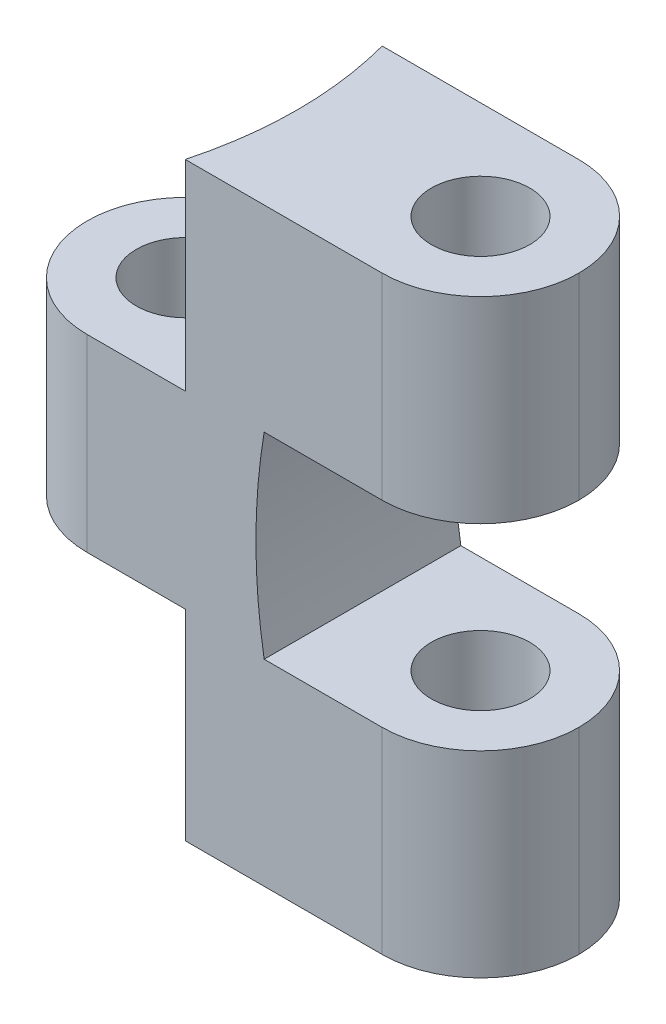
ISO-10303-21;
HEADER;
FILE_DESCRIPTION(('STEP AP214'),'2;1');
FILE_NAME('part.step','',(''),(''),'','','');
FILE_SCHEMA(('AUTOMOTIVE_DESIGN { 1 0 10303 214 1 1 1 1 }'));
ENDSEC;
DATA;
#1=APPLICATION_CONTEXT('core data for automotive mechanical design processes');
#2=APPLICATION_PROTOCOL_DEFINITION('international standard','automotive_design',2000,#1);
#3=PRODUCT_CONTEXT('',#1,'mechanical');
#4=PRODUCT('Part','Part','',(#3));
#5=PRODUCT_RELATED_PRODUCT_CATEGORY('part','',(#4));
#6=PRODUCT_DEFINITION_FORMATION('','',#4);
#7=PRODUCT_DEFINITION_CONTEXT('part definition',#1,'design');
#8=PRODUCT_DEFINITION('design','',#6,#7);
#9=PRODUCT_DEFINITION_SHAPE('','',#8);
#10=(LENGTH_UNIT() NAMED_UNIT(*) SI_UNIT(.MILLI.,.METRE.));
#11=(NAMED_UNIT(*) PLANE_ANGLE_UNIT() SI_UNIT($,.RADIAN.));
#12=(NAMED_UNIT(*) SI_UNIT($,.STERADIAN.) SOLID_ANGLE_UNIT());
#13=UNCERTAINTY_MEASURE_WITH_UNIT(LENGTH_MEASURE(1.E-05),#10,'distance_accuracy_value','');
#14=(GEOMETRIC_REPRESENTATION_CONTEXT(3) GLOBAL_UNCERTAINTY_ASSIGNED_CONTEXT((#13)) GLOBAL_UNIT_ASSIGNED_CONTEXT((#10,
#11,#12)) REPRESENTATION_CONTEXT('',''));
#15=CARTESIAN_POINT('',(0.,0.,0.));
#16=DIRECTION('',(0.,0.,1.));
#17=DIRECTION('',(1.,0.,0.));
#18=AXIS2_PLACEMENT_3D('',#15,#16,#17);
#19=CARTESIAN_POINT('',(-9.99999999999999,-39.0322943214974,10.));
#20=DIRECTION('',(1.,0.,0.));
#21=DIRECTION('',(0.,1.,0.));
#22=AXIS2_PLACEMENT_3D('',#19,#20,#21);
#23=PLANE('',#22);
#24=DIRECTION('',(0.,-1.,0.));
#25=VECTOR('',#24,1.);
#26=CARTESIAN_POINT('',(-9.99999999999999,-39.0322943214974,0.));
#27=LINE('',#26,#25);
#28=CARTESIAN_POINT('',(-10.,-4.8,0.));
#29=VERTEX_POINT('',#28);
#30=CARTESIAN_POINT('',(-10.,-5.,0.));
#31=VERTEX_POINT('',#30);
#32=EDGE_CURVE('E214',#29,#31,#27,.T.);
#33=ORIENTED_EDGE('',*,*,#32,.T.);
#34=DIRECTION('',(0.,0.,-1.));
#35=VECTOR('',#34,1.);
#36=CARTESIAN_POINT('',(-10.,-5.,10.));
#37=LINE('',#36,#35);
#38=CARTESIAN_POINT('',(-10.,-5.,10.));
#39=VERTEX_POINT('',#38);
#40=EDGE_CURVE('E199',#39,#31,#37,.T.);
#41=ORIENTED_EDGE('',*,*,#40,.F.);
#42=DIRECTION('',(0.,-1.,0.));
#43=VECTOR('',#42,1.);
#44=CARTESIAN_POINT('',(-9.99999999999999,-39.0322943214974,10.));
#45=LINE('',#44,#43);
#46=CARTESIAN_POINT('',(-10.,-4.8,10.));
#47=VERTEX_POINT('',#46);
#48=EDGE_CURVE('E215',#47,#39,#45,.T.);
#49=ORIENTED_EDGE('',*,*,#48,.F.);
#50=DIRECTION('',(0.,0.,-1.));
#51=VECTOR('',#50,1.);
#52=CARTESIAN_POINT('',(-10.,-4.8,10.));
#53=LINE('',#52,#51);
#54=EDGE_CURVE('E231',#47,#29,#53,.T.);
#55=ORIENTED_EDGE('',*,*,#54,.T.);
#56=EDGE_LOOP('',(#33,#41,#49,#55));
#57=FACE_BOUND('',#56,.T.);
#58=ADVANCED_FACE('F33',(#57),#23,.F.);
#59=CARTESIAN_POINT('',(0.,-15.,10.));
#60=DIRECTION('',(0.,1.,0.));
#61=DIRECTION('',(-1.,0.,0.));
#62=AXIS2_PLACEMENT_3D('',#59,#60,#61);
#63=PLANE('',#62);
#64=CARTESIAN_POINT('',(0.,-15.,5.));
#65=DIRECTION('',(0.,1.,0.));
#66=DIRECTION('',(-1.,0.,0.));
#67=AXIS2_PLACEMENT_3D('',#64,#65,#66);
#68=CIRCLE('',#67,2.5);
#69=CARTESIAN_POINT('',(-2.5,-15.,5.));
#70=VERTEX_POINT('',#69);
#71=EDGE_CURVE('E273',#70,#70,#68,.F.);
#72=ORIENTED_EDGE('',*,*,#71,.F.);
#73=EDGE_LOOP('',(#72));
#74=FACE_BOUND('',#73,.T.);
#75=DIRECTION('',(1.,0.,0.));
#76=VECTOR('',#75,1.);
#77=CARTESIAN_POINT('',(0.,-15.,0.));
#78=LINE('',#77,#76);
#79=CARTESIAN_POINT('',(-10.,-15.,0.));
#80=VERTEX_POINT('',#79);
#81=CARTESIAN_POINT('',(0.,-15.,0.));
#82=VERTEX_POINT('',#81);
#83=EDGE_CURVE('E234',#80,#82,#78,.T.);
#84=ORIENTED_EDGE('',*,*,#83,.T.);
#85=CARTESIAN_POINT('',(0.,-15.,5.));
#86=DIRECTION('',(0.,1.,0.));
#87=DIRECTION('',(-1.,0.,0.));
#88=AXIS2_PLACEMENT_3D('',#85,#86,#87);
#89=CIRCLE('',#88,5.);
#90=CARTESIAN_POINT('',(5.,-15.,5.));
#91=VERTEX_POINT('',#90);
#92=EDGE_CURVE('E283',#82,#91,#89,.F.);
#93=ORIENTED_EDGE('',*,*,#92,.T.);
#94=CARTESIAN_POINT('',(0.,-15.,5.));
#95=DIRECTION('',(0.,1.,0.));
#96=DIRECTION('',(-1.,0.,0.));
#97=AXIS2_PLACEMENT_3D('',#94,#95,#96);
#98=CIRCLE('',#97,5.);
#99=CARTESIAN_POINT('',(0.,-15.,10.));
#100=VERTEX_POINT('',#99);
#101=EDGE_CURVE('E281',#91,#100,#98,.F.);
#102=ORIENTED_EDGE('',*,*,#101,.T.);
#103=DIRECTION('',(1.,0.,0.));
#104=VECTOR('',#103,1.);
#105=CARTESIAN_POINT('',(0.,-15.,10.));
#106=LINE('',#105,#104);
#107=CARTESIAN_POINT('',(-10.,-15.,10.));
#108=VERTEX_POINT('',#107);
#109=EDGE_CURVE('E218',#108,#100,#106,.T.);
#110=ORIENTED_EDGE('',*,*,#109,.F.);
#111=CARTESIAN_POINT('',(-28.6602540378443,-15.,5.));
#112=DIRECTION('',(0.,-1.,0.));
#113=DIRECTION('',(-1.,0.,0.));
#114=AXIS2_PLACEMENT_3D('',#111,#112,#113);
#115=CIRCLE('',#114,19.3185165257813);
#116=EDGE_CURVE('E195',#80,#108,#115,.T.);
#117=ORIENTED_EDGE('',*,*,#116,.F.);
#118=EDGE_LOOP('',(#84,#93,#102,#110,#117));
#119=FACE_BOUND('',#118,.T.);
#120=ADVANCED_FACE('F342',(#74,#119),#63,.F.);
#121=CARTESIAN_POINT('',(0.,15.,10.));
#122=DIRECTION('',(0.,1.,0.));
#123=DIRECTION('',(0.,0.,1.));
#124=AXIS2_PLACEMENT_3D('',#121,#122,#123);
#125=PLANE('',#124);
#126=CARTESIAN_POINT('',(0.,15.,5.));
#127=DIRECTION('',(0.,1.,0.));
#128=DIRECTION('',(0.,0.,1.));
#129=AXIS2_PLACEMENT_3D('',#126,#127,#128);
#130=CIRCLE('',#129,2.5);
#131=CARTESIAN_POINT('',(0.,15.,7.5));
#132=VERTEX_POINT('',#131);
#133=EDGE_CURVE('E295',#132,#132,#130,.T.);
#134=ORIENTED_EDGE('',*,*,#133,.F.);
#135=EDGE_LOOP('',(#134));
#136=FACE_BOUND('',#135,.T.);
#137=DIRECTION('',(1.,0.,0.));
#138=VECTOR('',#137,1.);
#139=CARTESIAN_POINT('',(0.,15.,10.));
#140=LINE('',#139,#138);
#141=CARTESIAN_POINT('',(-10.,15.,10.));
#142=VERTEX_POINT('',#141);
#143=CARTESIAN_POINT('',(0.,15.,10.));
#144=VERTEX_POINT('',#143);
#145=EDGE_CURVE('E222',#142,#144,#140,.T.);
#146=ORIENTED_EDGE('',*,*,#145,.T.);
#147=CARTESIAN_POINT('',(0.,15.,5.));
#148=DIRECTION('',(0.,1.,0.));
#149=DIRECTION('',(0.,0.,1.));
#150=AXIS2_PLACEMENT_3D('',#147,#148,#149);
#151=CIRCLE('',#150,5.);
#152=CARTESIAN_POINT('',(5.,15.,5.));
#153=VERTEX_POINT('',#152);
#154=EDGE_CURVE('E56',#144,#153,#151,.T.);
#155=ORIENTED_EDGE('',*,*,#154,.T.);
#156=CARTESIAN_POINT('',(0.,15.,5.));
#157=DIRECTION('',(0.,1.,0.));
#158=DIRECTION('',(0.,0.,1.));
#159=AXIS2_PLACEMENT_3D('',#156,#157,#158);
#160=CIRCLE('',#159,5.);
#161=CARTESIAN_POINT('',(0.,15.,0.));
#162=VERTEX_POINT('',#161);
#163=EDGE_CURVE('E290',#153,#162,#160,.T.);
#164=ORIENTED_EDGE('',*,*,#163,.T.);
#165=DIRECTION('',(1.,0.,0.));
#166=VECTOR('',#165,1.);
#167=CARTESIAN_POINT('',(0.,15.,0.));
#168=LINE('',#167,#166);
#169=CARTESIAN_POINT('',(-10.,15.,0.));
#170=VERTEX_POINT('',#169);
#171=EDGE_CURVE('E237',#170,#162,#168,.T.);
#172=ORIENTED_EDGE('',*,*,#171,.F.);
#173=CARTESIAN_POINT('',(-28.5679721298959,15.,4.97527313728922));
#174=DIRECTION('',(0.,1.,0.));
#175=DIRECTION('',(0.,0.,-1.));
#176=AXIS2_PLACEMENT_3D('',#173,#174,#175);
#177=CIRCLE('',#176,19.2229792645995);
#178=CARTESIAN_POINT('',(-10.,15.,9.95054627457844));
#179=VERTEX_POINT('',#178);
#180=EDGE_CURVE('E180',#179,#170,#177,.T.);
#181=ORIENTED_EDGE('',*,*,#180,.F.);
#182=DIRECTION('',(0.,0.,-1.));
#183=VECTOR('',#182,1.);
#184=CARTESIAN_POINT('',(-10.,15.,10.));
#185=LINE('',#184,#183);
#186=EDGE_CURVE('E251',#142,#179,#185,.T.);
#187=ORIENTED_EDGE('',*,*,#186,.F.);
#188=EDGE_LOOP('',(#146,#155,#164,#172,#181,#187));
#189=FACE_BOUND('',#188,.T.);
#190=ADVANCED_FACE('F308',(#136,#189),#125,.T.);
#191=CARTESIAN_POINT('',(-10.,-39.0322943214974,10.));
#192=DIRECTION('',(1.,0.,0.));
#193=DIRECTION('',(0.,0.,-1.));
#194=AXIS2_PLACEMENT_3D('',#191,#192,#193);
#195=PLANE('',#194);
#196=ORIENTED_EDGE('',*,*,#186,.T.);
#197=DIRECTION('',(0.,1.,0.));
#198=VECTOR('',#197,1.);
#199=CARTESIAN_POINT('',(-10.,5.,9.95054627457844));
#200=LINE('',#199,#198);
#201=CARTESIAN_POINT('',(-10.,5.,9.95054627457844));
#202=VERTEX_POINT('',#201);
#203=EDGE_CURVE('E192',#202,#179,#200,.T.);
#204=ORIENTED_EDGE('',*,*,#203,.F.);
#205=DIRECTION('',(0.,0.,1.));
#206=VECTOR('',#205,1.);
#207=CARTESIAN_POINT('',(-10.,5.,9.95054627457844));
#208=LINE('',#207,#206);
#209=CARTESIAN_POINT('',(-10.,5.,0.));
#210=VERTEX_POINT('',#209);
#211=EDGE_CURVE('E190',#210,#202,#208,.T.);
#212=ORIENTED_EDGE('',*,*,#211,.F.);
#213=DIRECTION('',(0.,-1.,0.));
#214=VECTOR('',#213,1.);
#215=CARTESIAN_POINT('',(-10.,-39.0322943214974,0.));
#216=LINE('',#215,#214);
#217=CARTESIAN_POINT('',(-10.,4.80000000000001,0.));
#218=VERTEX_POINT('',#217);
#219=EDGE_CURVE('E239',#210,#218,#216,.T.);
#220=ORIENTED_EDGE('',*,*,#219,.T.);
#221=DIRECTION('',(0.,0.,-1.));
#222=VECTOR('',#221,1.);
#223=CARTESIAN_POINT('',(-10.,4.80000000000001,10.));
#224=LINE('',#223,#222);
#225=CARTESIAN_POINT('',(-10.,4.80000000000001,10.));
#226=VERTEX_POINT('',#225);
#227=EDGE_CURVE('E248',#226,#218,#224,.T.);
#228=ORIENTED_EDGE('',*,*,#227,.F.);
#229=DIRECTION('',(0.,-1.,0.));
#230=VECTOR('',#229,1.);
#231=CARTESIAN_POINT('',(-10.,-39.0322943214974,10.));
#232=LINE('',#231,#230);
#233=EDGE_CURVE('E224',#142,#226,#232,.T.);
#234=ORIENTED_EDGE('',*,*,#233,.F.);
#235=EDGE_LOOP('',(#196,#204,#212,#220,#228,#234));
#236=FACE_BOUND('',#235,.T.);
#237=ADVANCED_FACE('F319',(#236),#195,.F.);
#238=CARTESIAN_POINT('',(0.,4.80000000000001,10.));
#239=DIRECTION('',(0.,1.,0.));
#240=DIRECTION('',(-1.,0.,0.));
#241=AXIS2_PLACEMENT_3D('',#238,#239,#240);
#242=PLANE('',#241);
#243=CARTESIAN_POINT('',(-15.,4.80000000000001,5.));
#244=DIRECTION('',(0.,1.,0.));
#245=DIRECTION('',(-1.,0.,0.));
#246=AXIS2_PLACEMENT_3D('',#243,#244,#245);
#247=CIRCLE('',#246,2.5);
#248=CARTESIAN_POINT('',(-17.5,4.80000000000001,5.));
#249=VERTEX_POINT('',#248);
#250=EDGE_CURVE('E211',#249,#249,#247,.T.);
#251=ORIENTED_EDGE('',*,*,#250,.F.);
#252=EDGE_LOOP('',(#251));
#253=FACE_BOUND('',#252,.T.);
#254=DIRECTION('',(1.,0.,0.));
#255=VECTOR('',#254,1.);
#256=CARTESIAN_POINT('',(0.,4.80000000000001,0.));
#257=LINE('',#256,#255);
#258=CARTESIAN_POINT('',(-15.,4.80000000000001,0.));
#259=VERTEX_POINT('',#258);
#260=EDGE_CURVE('E242',#259,#218,#257,.T.);
#261=ORIENTED_EDGE('',*,*,#260,.F.);
#262=CARTESIAN_POINT('',(-15.,4.80000000000001,5.));
#263=DIRECTION('',(0.,1.,0.));
#264=DIRECTION('',(-1.,0.,0.));
#265=AXIS2_PLACEMENT_3D('',#262,#263,#264);
#266=CIRCLE('',#265,5.);
#267=CARTESIAN_POINT('',(-20.,4.8,5.));
#268=VERTEX_POINT('',#267);
#269=EDGE_CURVE('E263',#259,#268,#266,.T.);
#270=ORIENTED_EDGE('',*,*,#269,.T.);
#271=CARTESIAN_POINT('',(-15.,4.80000000000001,5.));
#272=DIRECTION('',(0.,1.,0.));
#273=DIRECTION('',(-1.,0.,0.));
#274=AXIS2_PLACEMENT_3D('',#271,#272,#273);
#275=CIRCLE('',#274,5.);
#276=CARTESIAN_POINT('',(-15.,4.80000000000001,10.));
#277=VERTEX_POINT('',#276);
#278=EDGE_CURVE('E261',#268,#277,#275,.T.);
#279=ORIENTED_EDGE('',*,*,#278,.T.);
#280=DIRECTION('',(1.,0.,0.));
#281=VECTOR('',#280,1.);
#282=CARTESIAN_POINT('',(0.,4.80000000000001,10.));
#283=LINE('',#282,#281);
#284=EDGE_CURVE('E227',#277,#226,#283,.T.);
#285=ORIENTED_EDGE('',*,*,#284,.T.);
#286=ORIENTED_EDGE('',*,*,#227,.T.);
#287=EDGE_LOOP('',(#261,#270,#279,#285,#286));
#288=FACE_BOUND('',#287,.T.);
#289=ADVANCED_FACE('F377',(#253,#288),#242,.T.);
#290=CARTESIAN_POINT('',(0.,-4.8,10.));
#291=DIRECTION('',(0.,1.,0.));
#292=DIRECTION('',(0.,0.,1.));
#293=AXIS2_PLACEMENT_3D('',#290,#291,#292);
#294=PLANE('',#293);
#295=CARTESIAN_POINT('',(-15.,-4.8,5.));
#296=DIRECTION('',(0.,-1.,0.));
#297=DIRECTION('',(0.,0.,-1.));
#298=AXIS2_PLACEMENT_3D('',#295,#296,#297);
#299=CIRCLE('',#298,2.5);
#300=CARTESIAN_POINT('',(-15.,-4.8,2.5));
#301=VERTEX_POINT('',#300);
#302=EDGE_CURVE('E208',#301,#301,#299,.T.);
#303=ORIENTED_EDGE('',*,*,#302,.F.);
#304=EDGE_LOOP('',(#303));
#305=FACE_BOUND('',#304,.T.);
#306=CARTESIAN_POINT('',(-15.,-4.8,5.));
#307=DIRECTION('',(0.,1.,0.));
#308=DIRECTION('',(0.,0.,1.));
#309=AXIS2_PLACEMENT_3D('',#306,#307,#308);
#310=CIRCLE('',#309,5.);
#311=CARTESIAN_POINT('',(-15.,-4.8,10.));
#312=VERTEX_POINT('',#311);
#313=CARTESIAN_POINT('',(-20.,-4.79999999999999,5.));
#314=VERTEX_POINT('',#313);
#315=EDGE_CURVE('E254',#312,#314,#310,.F.);
#316=ORIENTED_EDGE('',*,*,#315,.T.);
#317=CARTESIAN_POINT('',(-15.,-4.8,5.));
#318=DIRECTION('',(0.,1.,0.));
#319=DIRECTION('',(0.,0.,1.));
#320=AXIS2_PLACEMENT_3D('',#317,#318,#319);
#321=CIRCLE('',#320,5.);
#322=CARTESIAN_POINT('',(-15.,-4.8,0.));
#323=VERTEX_POINT('',#322);
#324=EDGE_CURVE('E256',#314,#323,#321,.F.);
#325=ORIENTED_EDGE('',*,*,#324,.T.);
#326=DIRECTION('',(1.,0.,0.));
#327=VECTOR('',#326,1.);
#328=CARTESIAN_POINT('',(0.,-4.8,0.));
#329=LINE('',#328,#327);
#330=EDGE_CURVE('E219',#323,#29,#329,.T.);
#331=ORIENTED_EDGE('',*,*,#330,.T.);
#332=ORIENTED_EDGE('',*,*,#54,.F.);
#333=DIRECTION('',(1.,0.,0.));
#334=VECTOR('',#333,1.);
#335=CARTESIAN_POINT('',(0.,-4.8,10.));
#336=LINE('',#335,#334);
#337=EDGE_CURVE('E229',#312,#47,#336,.T.);
#338=ORIENTED_EDGE('',*,*,#337,.F.);
#339=EDGE_LOOP('',(#316,#325,#331,#332,#338));
#340=FACE_BOUND('',#339,.T.);
#341=ADVANCED_FACE('F383',(#305,#340),#294,.F.);
#342=CARTESIAN_POINT('',(0.,-39.0322943214974,10.));
#343=DIRECTION('',(0.,0.,1.));
#344=DIRECTION('',(1.,0.,0.));
#345=AXIS2_PLACEMENT_3D('',#342,#343,#344);
#346=PLANE('',#345);
#347=ORIENTED_EDGE('',*,*,#109,.T.);
#348=DIRECTION('',(0.,1.,0.));
#349=VECTOR('',#348,1.);
#350=CARTESIAN_POINT('',(0.,-5.,10.));
#351=LINE('',#350,#349);
#352=CARTESIAN_POINT('',(0.,-5.,10.));
#353=VERTEX_POINT('',#352);
#354=EDGE_CURVE('E288',#100,#353,#351,.T.);
#355=ORIENTED_EDGE('',*,*,#354,.T.);
#356=DIRECTION('',(1.,0.,0.));
#357=VECTOR('',#356,1.);
#358=CARTESIAN_POINT('',(-6.,-5.,10.));
#359=LINE('',#358,#357);
#360=CARTESIAN_POINT('',(-6.,-5.,10.));
#361=VERTEX_POINT('',#360);
#362=EDGE_CURVE('E327',#361,#353,#359,.T.);
#363=ORIENTED_EDGE('',*,*,#362,.F.);
#364=CARTESIAN_POINT('',(23.5803989154981,0.,10.));
#365=DIRECTION('',(0.,0.,1.));
#366=DIRECTION('',(1.,0.,0.));
#367=AXIS2_PLACEMENT_3D('',#364,#365,#366);
#368=CIRCLE('',#367,30.);
#369=CARTESIAN_POINT('',(-6.,5.,10.));
#370=VERTEX_POINT('',#369);
#371=EDGE_CURVE('E174',#370,#361,#368,.T.);
#372=ORIENTED_EDGE('',*,*,#371,.F.);
#373=DIRECTION('',(-1.,0.,0.));
#374=VECTOR('',#373,1.);
#375=CARTESIAN_POINT('',(-6.,5.,10.));
#376=LINE('',#375,#374);
#377=CARTESIAN_POINT('',(0.,5.,10.));
#378=VERTEX_POINT('',#377);
#379=EDGE_CURVE('E179',#378,#370,#376,.T.);
#380=ORIENTED_EDGE('',*,*,#379,.F.);
#381=DIRECTION('',(0.,1.,0.));
#382=VECTOR('',#381,1.);
#383=CARTESIAN_POINT('',(0.,15.,10.));
#384=LINE('',#383,#382);
#385=EDGE_CURVE('E285',#378,#144,#384,.T.);
#386=ORIENTED_EDGE('',*,*,#385,.T.);
#387=ORIENTED_EDGE('',*,*,#145,.F.);
#388=ORIENTED_EDGE('',*,*,#233,.T.);
#389=ORIENTED_EDGE('',*,*,#284,.F.);
#390=DIRECTION('',(0.,-1.,0.));
#391=VECTOR('',#390,1.);
#392=CARTESIAN_POINT('',(-15.,-4.79999999999999,10.));
#393=LINE('',#392,#391);
#394=EDGE_CURVE('E265',#277,#312,#393,.T.);
#395=ORIENTED_EDGE('',*,*,#394,.T.);
#396=ORIENTED_EDGE('',*,*,#337,.T.);
#397=ORIENTED_EDGE('',*,*,#48,.T.);
#398=DIRECTION('',(0.,-1.,0.));
#399=VECTOR('',#398,1.);
#400=CARTESIAN_POINT('',(-10.,-5.,10.));
#401=LINE('',#400,#399);
#402=EDGE_CURVE('E201',#39,#108,#401,.T.);
#403=ORIENTED_EDGE('',*,*,#402,.T.);
#404=EDGE_LOOP('',(#347,#355,#363,#372,#380,#386,#387,#388,#389,#395,#396,#397,#403));
#405=FACE_BOUND('',#404,.T.);
#406=ADVANCED_FACE('F325',(#405),#346,.T.);
#407=CARTESIAN_POINT('',(0.,-39.0322943214974,0.));
#408=DIRECTION('',(0.,0.,1.));
#409=DIRECTION('',(1.,0.,0.));
#410=AXIS2_PLACEMENT_3D('',#407,#408,#409);
#411=PLANE('',#410);
#412=DIRECTION('',(1.,0.,0.));
#413=VECTOR('',#412,1.);
#414=CARTESIAN_POINT('',(-6.,-5.,0.));
#415=LINE('',#414,#413);
#416=CARTESIAN_POINT('',(-6.,-5.,0.));
#417=VERTEX_POINT('',#416);
#418=CARTESIAN_POINT('',(0.,-5.,0.));
#419=VERTEX_POINT('',#418);
#420=EDGE_CURVE('E166',#417,#419,#415,.T.);
#421=ORIENTED_EDGE('',*,*,#420,.T.);
#422=DIRECTION('',(0.,1.,0.));
#423=VECTOR('',#422,1.);
#424=CARTESIAN_POINT('',(0.,-39.0322943214974,0.));
#425=LINE('',#424,#423);
#426=EDGE_CURVE('E278',#419,#82,#425,.F.);
#427=ORIENTED_EDGE('',*,*,#426,.T.);
#428=ORIENTED_EDGE('',*,*,#83,.F.);
#429=DIRECTION('',(0.,-1.,0.));
#430=VECTOR('',#429,1.);
#431=CARTESIAN_POINT('',(-10.,-5.,0.));
#432=LINE('',#431,#430);
#433=EDGE_CURVE('E203',#31,#80,#432,.T.);
#434=ORIENTED_EDGE('',*,*,#433,.F.);
#435=ORIENTED_EDGE('',*,*,#32,.F.);
#436=ORIENTED_EDGE('',*,*,#330,.F.);
#437=DIRECTION('',(0.,-1.,0.));
#438=VECTOR('',#437,1.);
#439=CARTESIAN_POINT('',(-15.,-39.0322943214974,0.));
#440=LINE('',#439,#438);
#441=EDGE_CURVE('E258',#323,#259,#440,.F.);
#442=ORIENTED_EDGE('',*,*,#441,.T.);
#443=ORIENTED_EDGE('',*,*,#260,.T.);
#444=ORIENTED_EDGE('',*,*,#219,.F.);
#445=EDGE_CURVE('E240',#170,#210,#216,.T.);
#446=ORIENTED_EDGE('',*,*,#445,.F.);
#447=ORIENTED_EDGE('',*,*,#171,.T.);
#448=DIRECTION('',(0.,1.,0.));
#449=VECTOR('',#448,1.);
#450=CARTESIAN_POINT('',(0.,-39.0322943214974,0.));
#451=LINE('',#450,#449);
#452=CARTESIAN_POINT('',(0.,5.,0.));
#453=VERTEX_POINT('',#452);
#454=EDGE_CURVE('E163',#162,#453,#451,.F.);
#455=ORIENTED_EDGE('',*,*,#454,.T.);
#456=DIRECTION('',(-1.,0.,0.));
#457=VECTOR('',#456,1.);
#458=CARTESIAN_POINT('',(-6.,5.,0.));
#459=LINE('',#458,#457);
#460=CARTESIAN_POINT('',(-6.,5.,0.));
#461=VERTEX_POINT('',#460);
#462=EDGE_CURVE('E155',#453,#461,#459,.T.);
#463=ORIENTED_EDGE('',*,*,#462,.T.);
#464=CARTESIAN_POINT('',(23.5803989154981,0.,0.));
#465=DIRECTION('',(0.,0.,-1.));
#466=DIRECTION('',(1.,0.,0.));
#467=AXIS2_PLACEMENT_3D('',#464,#465,#466);
#468=CIRCLE('',#467,30.);
#469=EDGE_CURVE('E159',#417,#461,#468,.T.);
#470=ORIENTED_EDGE('',*,*,#469,.F.);
#471=EDGE_LOOP('',(#421,#427,#428,#434,#435,#436,#442,#443,#444,#446,#447,#455,#463,#470));
#472=FACE_BOUND('',#471,.T.);
#473=ADVANCED_FACE('F158',(#472),#411,.F.);
#474=CARTESIAN_POINT('',(-15.,5.2,5.));
#475=DIRECTION('',(0.,-1.,0.));
#476=DIRECTION('',(0.,0.,-1.));
#477=AXIS2_PLACEMENT_3D('',#474,#475,#476);
#478=CYLINDRICAL_SURFACE('',#477,2.5);
#479=ORIENTED_EDGE('',*,*,#250,.T.);
#480=EDGE_LOOP('',(#479));
#481=FACE_BOUND('',#480,.T.);
#482=ORIENTED_EDGE('',*,*,#302,.T.);
#483=EDGE_LOOP('',(#482));
#484=FACE_BOUND('',#483,.T.);
#485=ADVANCED_FACE('F408',(#481,#484),#478,.F.);
#486=CARTESIAN_POINT('',(-15.,-39.0322943214974,5.));
#487=DIRECTION('',(0.,1.,0.));
#488=DIRECTION('',(0.,0.,1.));
#489=AXIS2_PLACEMENT_3D('',#486,#487,#488);
#490=CYLINDRICAL_SURFACE('',#489,5.);
#491=ORIENTED_EDGE('',*,*,#394,.F.);
#492=ORIENTED_EDGE('',*,*,#278,.F.);
#493=DIRECTION('',(0.,-1.,0.));
#494=VECTOR('',#493,1.);
#495=CARTESIAN_POINT('',(-20.,4.8,5.));
#496=LINE('',#495,#494);
#497=EDGE_CURVE('E205',#314,#268,#496,.F.);
#498=ORIENTED_EDGE('',*,*,#497,.F.);
#499=ORIENTED_EDGE('',*,*,#315,.F.);
#500=EDGE_LOOP('',(#491,#492,#498,#499));
#501=FACE_BOUND('',#500,.T.);
#502=ADVANCED_FACE('F380',(#501),#490,.T.);
#503=CARTESIAN_POINT('',(-15.,-39.0322943214974,5.));
#504=DIRECTION('',(0.,-1.,0.));
#505=DIRECTION('',(0.,0.,-1.));
#506=AXIS2_PLACEMENT_3D('',#503,#504,#505);
#507=CYLINDRICAL_SURFACE('',#506,5.);
#508=ORIENTED_EDGE('',*,*,#269,.F.);
#509=ORIENTED_EDGE('',*,*,#441,.F.);
#510=ORIENTED_EDGE('',*,*,#324,.F.);
#511=ORIENTED_EDGE('',*,*,#497,.T.);
#512=EDGE_LOOP('',(#508,#509,#510,#511));
#513=FACE_BOUND('',#512,.T.);
#514=ADVANCED_FACE('F373',(#513),#507,.T.);
#515=CARTESIAN_POINT('',(-28.6602540378443,-5.,5.));
#516=DIRECTION('',(0.,-1.,0.));
#517=DIRECTION('',(1.,0.,0.));
#518=AXIS2_PLACEMENT_3D('',#515,#516,#517);
#519=CYLINDRICAL_SURFACE('',#518,19.3185165257813);
#520=ORIENTED_EDGE('',*,*,#116,.T.);
#521=ORIENTED_EDGE('',*,*,#402,.F.);
#522=CARTESIAN_POINT('',(-28.6602540378443,-5.,5.));
#523=DIRECTION('',(0.,-1.,0.));
#524=DIRECTION('',(-1.,0.,0.));
#525=AXIS2_PLACEMENT_3D('',#522,#523,#524);
#526=CIRCLE('',#525,19.3185165257813);
#527=EDGE_CURVE('E196',#31,#39,#526,.T.);
#528=ORIENTED_EDGE('',*,*,#527,.F.);
#529=ORIENTED_EDGE('',*,*,#433,.T.);
#530=EDGE_LOOP('',(#520,#521,#528,#529));
#531=FACE_BOUND('',#530,.T.);
#532=ADVANCED_FACE('F361',(#531),#519,.F.);
#533=CARTESIAN_POINT('',(-28.6602540378443,-5.,5.));
#534=DIRECTION('',(0.,1.,0.));
#535=DIRECTION('',(-1.,0.,0.));
#536=AXIS2_PLACEMENT_3D('',#533,#534,#535);
#537=PLANE('',#536);
#538=ORIENTED_EDGE('',*,*,#527,.T.);
#539=ORIENTED_EDGE('',*,*,#40,.T.);
#540=EDGE_LOOP('',(#538,#539));
#541=FACE_BOUND('',#540,.T.);
#542=ADVANCED_FACE('F364',(#541),#537,.F.);
#543=CARTESIAN_POINT('',(-28.5679721298959,5.,4.97527313728922));
#544=DIRECTION('',(0.,1.,0.));
#545=DIRECTION('',(0.,0.,1.));
#546=AXIS2_PLACEMENT_3D('',#543,#544,#545);
#547=CYLINDRICAL_SURFACE('',#546,19.2229792645995);
#548=ORIENTED_EDGE('',*,*,#180,.T.);
#549=ORIENTED_EDGE('',*,*,#445,.T.);
#550=CARTESIAN_POINT('',(-28.5679721298959,5.,4.97527313728922));
#551=DIRECTION('',(0.,1.,0.));
#552=DIRECTION('',(0.,0.,-1.));
#553=AXIS2_PLACEMENT_3D('',#550,#551,#552);
#554=CIRCLE('',#553,19.2229792645995);
#555=EDGE_CURVE('E182',#202,#210,#554,.T.);
#556=ORIENTED_EDGE('',*,*,#555,.F.);
#557=ORIENTED_EDGE('',*,*,#203,.T.);
#558=EDGE_LOOP('',(#548,#549,#556,#557));
#559=FACE_BOUND('',#558,.T.);
#560=ADVANCED_FACE('F313',(#559),#547,.F.);
#561=CARTESIAN_POINT('',(-28.5679721298959,5.,4.97527313728922));
#562=DIRECTION('',(0.,-1.,0.));
#563=DIRECTION('',(0.,0.,-1.));
#564=AXIS2_PLACEMENT_3D('',#561,#562,#563);
#565=PLANE('',#564);
#566=ORIENTED_EDGE('',*,*,#555,.T.);
#567=ORIENTED_EDGE('',*,*,#211,.T.);
#568=EDGE_LOOP('',(#566,#567));
#569=FACE_BOUND('',#568,.T.);
#570=ADVANCED_FACE('F316',(#569),#565,.F.);
#571=CARTESIAN_POINT('',(-6.,5.,0.));
#572=DIRECTION('',(0.,1.,0.));
#573=DIRECTION('',(0.,0.,1.));
#574=AXIS2_PLACEMENT_3D('',#571,#572,#573);
#575=PLANE('',#574);
#576=CARTESIAN_POINT('',(0.,5.,5.));
#577=DIRECTION('',(0.,1.,0.));
#578=DIRECTION('',(0.,0.,1.));
#579=AXIS2_PLACEMENT_3D('',#576,#577,#578);
#580=CIRCLE('',#579,2.5);
#581=CARTESIAN_POINT('',(0.,5.,7.5));
#582=VERTEX_POINT('',#581);
#583=EDGE_CURVE('E175',#582,#582,#580,.T.);
#584=ORIENTED_EDGE('',*,*,#583,.T.);
#585=EDGE_LOOP('',(#584));
#586=FACE_BOUND('',#585,.T.);
#587=CARTESIAN_POINT('',(0.,5.,5.));
#588=DIRECTION('',(0.,1.,0.));
#589=DIRECTION('',(0.,0.,1.));
#590=AXIS2_PLACEMENT_3D('',#587,#588,#589);
#591=CIRCLE('',#590,5.);
#592=CARTESIAN_POINT('',(5.,5.,5.));
#593=VERTEX_POINT('',#592);
#594=EDGE_CURVE('E42',#453,#593,#591,.F.);
#595=ORIENTED_EDGE('',*,*,#594,.T.);
#596=CARTESIAN_POINT('',(0.,5.,5.));
#597=DIRECTION('',(0.,1.,0.));
#598=DIRECTION('',(0.,0.,1.));
#599=AXIS2_PLACEMENT_3D('',#596,#597,#598);
#600=CIRCLE('',#599,5.);
#601=EDGE_CURVE('E11',#593,#378,#600,.F.);
#602=ORIENTED_EDGE('',*,*,#601,.T.);
#603=ORIENTED_EDGE('',*,*,#379,.T.);
#604=DIRECTION('',(0.,0.,1.));
#605=VECTOR('',#604,1.);
#606=CARTESIAN_POINT('',(-6.,5.,0.));
#607=LINE('',#606,#605);
#608=EDGE_CURVE('E171',#461,#370,#607,.T.);
#609=ORIENTED_EDGE('',*,*,#608,.F.);
#610=ORIENTED_EDGE('',*,*,#462,.F.);
#611=EDGE_LOOP('',(#595,#602,#603,#609,#610));
#612=FACE_BOUND('',#611,.T.);
#613=ADVANCED_FACE('F177',(#586,#612),#575,.F.);
#614=CARTESIAN_POINT('',(-6.,-5.,0.));
#615=DIRECTION('',(0.,-1.,0.));
#616=DIRECTION('',(0.,0.,-1.));
#617=AXIS2_PLACEMENT_3D('',#614,#615,#616);
#618=PLANE('',#617);
#619=CARTESIAN_POINT('',(0.,-5.,5.));
#620=DIRECTION('',(0.,-1.,0.));
#621=DIRECTION('',(0.,0.,-1.));
#622=AXIS2_PLACEMENT_3D('',#619,#620,#621);
#623=CIRCLE('',#622,2.5);
#624=CARTESIAN_POINT('',(0.,-5.,2.5));
#625=VERTEX_POINT('',#624);
#626=EDGE_CURVE('E270',#625,#625,#623,.T.);
#627=ORIENTED_EDGE('',*,*,#626,.T.);
#628=EDGE_LOOP('',(#627));
#629=FACE_BOUND('',#628,.T.);
#630=CARTESIAN_POINT('',(0.,-5.,5.));
#631=DIRECTION('',(0.,-1.,0.));
#632=DIRECTION('',(0.,0.,-1.));
#633=AXIS2_PLACEMENT_3D('',#630,#631,#632);
#634=CIRCLE('',#633,5.);
#635=CARTESIAN_POINT('',(5.,-5.,5.));
#636=VERTEX_POINT('',#635);
#637=EDGE_CURVE('E267',#353,#636,#634,.F.);
#638=ORIENTED_EDGE('',*,*,#637,.T.);
#639=CARTESIAN_POINT('',(0.,-5.,5.));
#640=DIRECTION('',(0.,-1.,0.));
#641=DIRECTION('',(0.,0.,-1.));
#642=AXIS2_PLACEMENT_3D('',#639,#640,#641);
#643=CIRCLE('',#642,5.);
#644=EDGE_CURVE('E275',#636,#419,#643,.F.);
#645=ORIENTED_EDGE('',*,*,#644,.T.);
#646=ORIENTED_EDGE('',*,*,#420,.F.);
#647=DIRECTION('',(0.,0.,1.));
#648=VECTOR('',#647,1.);
#649=CARTESIAN_POINT('',(-6.,-5.,0.));
#650=LINE('',#649,#648);
#651=EDGE_CURVE('E165',#417,#361,#650,.T.);
#652=ORIENTED_EDGE('',*,*,#651,.T.);
#653=ORIENTED_EDGE('',*,*,#362,.T.);
#654=EDGE_LOOP('',(#638,#645,#646,#652,#653));
#655=FACE_BOUND('',#654,.T.);
#656=ADVANCED_FACE('F354',(#629,#655),#618,.F.);
#657=CARTESIAN_POINT('',(23.5803989154981,0.,20.));
#658=DIRECTION('',(0.,0.,-1.));
#659=DIRECTION('',(-1.,0.,0.));
#660=AXIS2_PLACEMENT_3D('',#657,#658,#659);
#661=CYLINDRICAL_SURFACE('',#660,30.);
#662=ORIENTED_EDGE('',*,*,#371,.T.);
#663=ORIENTED_EDGE('',*,*,#651,.F.);
#664=ORIENTED_EDGE('',*,*,#469,.T.);
#665=ORIENTED_EDGE('',*,*,#608,.T.);
#666=EDGE_LOOP('',(#662,#663,#664,#665));
#667=FACE_BOUND('',#666,.T.);
#668=ADVANCED_FACE('F170',(#667),#661,.F.);
#669=CARTESIAN_POINT('',(0.,-22.0710678118655,5.));
#670=DIRECTION('',(0.,1.,0.));
#671=DIRECTION('',(0.,0.,1.));
#672=AXIS2_PLACEMENT_3D('',#669,#670,#671);
#673=CYLINDRICAL_SURFACE('',#672,2.5);
#674=ORIENTED_EDGE('',*,*,#71,.T.);
#675=EDGE_LOOP('',(#674));
#676=FACE_BOUND('',#675,.T.);
#677=ORIENTED_EDGE('',*,*,#626,.F.);
#678=EDGE_LOOP('',(#677));
#679=FACE_BOUND('',#678,.T.);
#680=ADVANCED_FACE('F339',(#676,#679),#673,.F.);
#681=ORIENTED_EDGE('',*,*,#133,.T.);
#682=EDGE_LOOP('',(#681));
#683=FACE_BOUND('',#682,.T.);
#684=ORIENTED_EDGE('',*,*,#583,.F.);
#685=EDGE_LOOP('',(#684));
#686=FACE_BOUND('',#685,.T.);
#687=ADVANCED_FACE('F412',(#683,#686),#673,.F.);
#688=CARTESIAN_POINT('',(0.,-39.0322943214974,5.));
#689=DIRECTION('',(0.,-1.,0.));
#690=DIRECTION('',(0.,0.,-1.));
#691=AXIS2_PLACEMENT_3D('',#688,#689,#690);
#692=CYLINDRICAL_SURFACE('',#691,5.);
#693=ORIENTED_EDGE('',*,*,#354,.F.);
#694=ORIENTED_EDGE('',*,*,#101,.F.);
#695=DIRECTION('',(0.,1.,0.));
#696=VECTOR('',#695,1.);
#697=CARTESIAN_POINT('',(5.,-15.,5.));
#698=LINE('',#697,#696);
#699=EDGE_CURVE('E293',#636,#91,#698,.F.);
#700=ORIENTED_EDGE('',*,*,#699,.F.);
#701=ORIENTED_EDGE('',*,*,#637,.F.);
#702=EDGE_LOOP('',(#693,#694,#700,#701));
#703=FACE_BOUND('',#702,.T.);
#704=ADVANCED_FACE('F357',(#703),#692,.T.);
#705=CARTESIAN_POINT('',(0.,-15.001,5.));
#706=DIRECTION('',(0.,1.,0.));
#707=DIRECTION('',(0.,0.,1.));
#708=AXIS2_PLACEMENT_3D('',#705,#706,#707);
#709=CYLINDRICAL_SURFACE('',#708,5.);
#710=ORIENTED_EDGE('',*,*,#92,.F.);
#711=ORIENTED_EDGE('',*,*,#426,.F.);
#712=ORIENTED_EDGE('',*,*,#644,.F.);
#713=ORIENTED_EDGE('',*,*,#699,.T.);
#714=EDGE_LOOP('',(#710,#711,#712,#713));
#715=FACE_BOUND('',#714,.T.);
#716=ADVANCED_FACE('F353',(#715),#709,.T.);
#717=CARTESIAN_POINT('',(0.,-15.001,5.));
#718=DIRECTION('',(0.,1.,0.));
#719=DIRECTION('',(0.,0.,1.));
#720=AXIS2_PLACEMENT_3D('',#717,#718,#719);
#721=CYLINDRICAL_SURFACE('',#720,5.);
#722=DIRECTION('',(0.,1.,0.));
#723=VECTOR('',#722,1.);
#724=CARTESIAN_POINT('',(5.,-15.001,5.));
#725=LINE('',#724,#723);
#726=EDGE_CURVE('E37',#593,#153,#725,.T.);
#727=ORIENTED_EDGE('',*,*,#726,.F.);
#728=ORIENTED_EDGE('',*,*,#594,.F.);
#729=ORIENTED_EDGE('',*,*,#454,.F.);
#730=ORIENTED_EDGE('',*,*,#163,.F.);
#731=EDGE_LOOP('',(#727,#728,#729,#730));
#732=FACE_BOUND('',#731,.T.);
#733=ADVANCED_FACE('F35',(#732),#721,.T.);
#734=CARTESIAN_POINT('',(0.,-39.0322943214974,5.));
#735=DIRECTION('',(0.,-1.,0.));
#736=DIRECTION('',(0.,0.,-1.));
#737=AXIS2_PLACEMENT_3D('',#734,#735,#736);
#738=CYLINDRICAL_SURFACE('',#737,5.);
#739=ORIENTED_EDGE('',*,*,#601,.F.);
#740=ORIENTED_EDGE('',*,*,#726,.T.);
#741=ORIENTED_EDGE('',*,*,#154,.F.);
#742=ORIENTED_EDGE('',*,*,#385,.F.);
#743=EDGE_LOOP('',(#739,#740,#741,#742));
#744=FACE_BOUND('',#743,.T.);
#745=ADVANCED_FACE('F304',(#744),#738,.T.);
#746=CLOSED_SHELL('',(#58,#120,#190,#237,#289,#341,#406,#473,#485,#502,#514,#532,#542,#560,#570,
#613,#656,#668,#680,#687,#704,#716,#733,#745));
#747=MANIFOLD_SOLID_BREP('B2',#746);
#748=ADVANCED_BREP_SHAPE_REPRESENTATION('',(#18,#747),#14);
#749=SHAPE_DEFINITION_REPRESENTATION(#9,#748);
ENDSEC;
END-ISO-10303-21;
